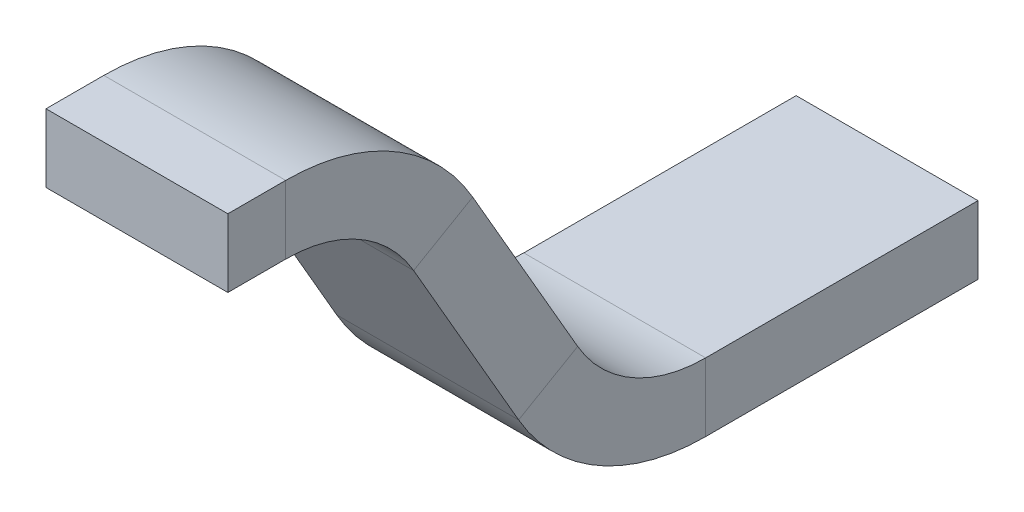
ISO-10303-21;
HEADER;
FILE_DESCRIPTION(('STEP AP214'),'2;1');
FILE_NAME('part.step','',(''),(''),'','','');
FILE_SCHEMA(('AUTOMOTIVE_DESIGN { 1 0 10303 214 1 1 1 1 }'));
ENDSEC;
DATA;
#1=APPLICATION_CONTEXT('core data for automotive mechanical design processes');
#2=APPLICATION_PROTOCOL_DEFINITION('international standard','automotive_design',2000,#1);
#3=PRODUCT_CONTEXT('',#1,'mechanical');
#4=PRODUCT('Part','Part','',(#3));
#5=PRODUCT_RELATED_PRODUCT_CATEGORY('part','',(#4));
#6=PRODUCT_DEFINITION_FORMATION('','',#4);
#7=PRODUCT_DEFINITION_CONTEXT('part definition',#1,'design');
#8=PRODUCT_DEFINITION('design','',#6,#7);
#9=PRODUCT_DEFINITION_SHAPE('','',#8);
#10=(LENGTH_UNIT() NAMED_UNIT(*) SI_UNIT(.MILLI.,.METRE.));
#11=(NAMED_UNIT(*) PLANE_ANGLE_UNIT() SI_UNIT($,.RADIAN.));
#12=(NAMED_UNIT(*) SI_UNIT($,.STERADIAN.) SOLID_ANGLE_UNIT());
#13=UNCERTAINTY_MEASURE_WITH_UNIT(LENGTH_MEASURE(1.E-05),#10,'distance_accuracy_value','');
#14=(GEOMETRIC_REPRESENTATION_CONTEXT(3) GLOBAL_UNCERTAINTY_ASSIGNED_CONTEXT((#13)) GLOBAL_UNIT_ASSIGNED_CONTEXT((#10,
#11,#12)) REPRESENTATION_CONTEXT('',''));
#15=CARTESIAN_POINT('',(0.,0.,0.));
#16=DIRECTION('',(0.,0.,1.));
#17=DIRECTION('',(1.,0.,0.));
#18=AXIS2_PLACEMENT_3D('',#15,#16,#17);
#19=CARTESIAN_POINT('',(0.,0.,0.));
#20=DIRECTION('',(0.,0.,1.));
#21=DIRECTION('',(1.,0.,0.));
#22=AXIS2_PLACEMENT_3D('',#19,#20,#21);
#23=PLANE('',#22);
#24=DIRECTION('',(0.,1.,0.));
#25=VECTOR('',#24,1.);
#26=CARTESIAN_POINT('',(0.2,0.075,0.));
#27=LINE('',#26,#25);
#28=CARTESIAN_POINT('',(0.2,-0.075,0.));
#29=VERTEX_POINT('',#28);
#30=CARTESIAN_POINT('',(0.2,0.075,0.));
#31=VERTEX_POINT('',#30);
#32=EDGE_CURVE('E243',#29,#31,#27,.T.);
#33=ORIENTED_EDGE('',*,*,#32,.T.);
#34=DIRECTION('',(-1.,0.,0.));
#35=VECTOR('',#34,1.);
#36=CARTESIAN_POINT('',(-0.2,0.075,0.));
#37=LINE('',#36,#35);
#38=CARTESIAN_POINT('',(-0.2,0.075,0.));
#39=VERTEX_POINT('',#38);
#40=EDGE_CURVE('E11',#31,#39,#37,.T.);
#41=ORIENTED_EDGE('',*,*,#40,.T.);
#42=DIRECTION('',(0.,-1.,0.));
#43=VECTOR('',#42,1.);
#44=CARTESIAN_POINT('',(-0.2,0.075,0.));
#45=LINE('',#44,#43);
#46=CARTESIAN_POINT('',(-0.2,-0.075,0.));
#47=VERTEX_POINT('',#46);
#48=EDGE_CURVE('E45',#39,#47,#45,.T.);
#49=ORIENTED_EDGE('',*,*,#48,.T.);
#50=DIRECTION('',(1.,0.,0.));
#51=VECTOR('',#50,1.);
#52=CARTESIAN_POINT('',(-0.2,-0.075,0.));
#53=LINE('',#52,#51);
#54=EDGE_CURVE('E93',#47,#29,#53,.T.);
#55=ORIENTED_EDGE('',*,*,#54,.T.);
#56=EDGE_LOOP('',(#33,#41,#49,#55));
#57=FACE_BOUND('',#56,.T.);
#58=ADVANCED_FACE('F17',(#57),#23,.T.);
#59=CARTESIAN_POINT('',(0.,-0.8,-1.65));
#60=DIRECTION('',(0.,0.,1.));
#61=DIRECTION('',(0.,-1.,0.));
#62=AXIS2_PLACEMENT_3D('',#59,#60,#61);
#63=PLANE('',#62);
#64=DIRECTION('',(0.,1.,0.));
#65=VECTOR('',#64,1.);
#66=CARTESIAN_POINT('',(0.2,-0.725,-1.65));
#67=LINE('',#66,#65);
#68=CARTESIAN_POINT('',(0.2,-0.875,-1.65));
#69=VERTEX_POINT('',#68);
#70=CARTESIAN_POINT('',(0.2,-0.725,-1.65));
#71=VERTEX_POINT('',#70);
#72=EDGE_CURVE('E175',#69,#71,#67,.T.);
#73=ORIENTED_EDGE('',*,*,#72,.F.);
#74=DIRECTION('',(1.,0.,0.));
#75=VECTOR('',#74,1.);
#76=CARTESIAN_POINT('',(-0.2,-0.875,-1.65));
#77=LINE('',#76,#75);
#78=CARTESIAN_POINT('',(-0.2,-0.875,-1.65));
#79=VERTEX_POINT('',#78);
#80=EDGE_CURVE('E397',#79,#69,#77,.T.);
#81=ORIENTED_EDGE('',*,*,#80,.F.);
#82=DIRECTION('',(0.,-1.,0.));
#83=VECTOR('',#82,1.);
#84=CARTESIAN_POINT('',(-0.2,-0.725,-1.65));
#85=LINE('',#84,#83);
#86=CARTESIAN_POINT('',(-0.2,-0.725,-1.65));
#87=VERTEX_POINT('',#86);
#88=EDGE_CURVE('E193',#87,#79,#85,.T.);
#89=ORIENTED_EDGE('',*,*,#88,.F.);
#90=DIRECTION('',(-1.,0.,0.));
#91=VECTOR('',#90,1.);
#92=CARTESIAN_POINT('',(-0.2,-0.725,-1.65));
#93=LINE('',#92,#91);
#94=EDGE_CURVE('E206',#71,#87,#93,.T.);
#95=ORIENTED_EDGE('',*,*,#94,.F.);
#96=EDGE_LOOP('',(#73,#81,#89,#95));
#97=FACE_BOUND('',#96,.T.);
#98=ADVANCED_FACE('F494',(#97),#63,.F.);
#99=CARTESIAN_POINT('',(-0.2,0.075,-0.127179676972));
#100=DIRECTION('',(0.,1.,0.));
#101=DIRECTION('',(1.,0.,0.));
#102=AXIS2_PLACEMENT_3D('',#99,#100,#101);
#103=PLANE('',#102);
#104=ORIENTED_EDGE('',*,*,#40,.F.);
#105=DIRECTION('',(0.,0.,1.));
#106=VECTOR('',#105,1.);
#107=CARTESIAN_POINT('',(0.2,0.075,-0.127179676972));
#108=LINE('',#107,#106);
#109=CARTESIAN_POINT('',(0.2,0.075,-0.127179676972));
#110=VERTEX_POINT('',#109);
#111=EDGE_CURVE('E85',#110,#31,#108,.T.);
#112=ORIENTED_EDGE('',*,*,#111,.F.);
#113=DIRECTION('',(-1.,0.,0.));
#114=VECTOR('',#113,1.);
#115=CARTESIAN_POINT('',(-0.2,0.075,-0.127179676972));
#116=LINE('',#115,#114);
#117=CARTESIAN_POINT('',(-0.2,0.075,-0.127179676972));
#118=VERTEX_POINT('',#117);
#119=EDGE_CURVE('E254',#110,#118,#116,.T.);
#120=ORIENTED_EDGE('',*,*,#119,.T.);
#121=DIRECTION('',(0.,0.,1.));
#122=VECTOR('',#121,1.);
#123=CARTESIAN_POINT('',(-0.2,0.075,-0.127179676972));
#124=LINE('',#123,#122);
#125=EDGE_CURVE('E25',#118,#39,#124,.T.);
#126=ORIENTED_EDGE('',*,*,#125,.T.);
#127=EDGE_LOOP('',(#104,#112,#120,#126));
#128=FACE_BOUND('',#127,.T.);
#129=ADVANCED_FACE('F496',(#128),#103,.T.);
#130=CARTESIAN_POINT('',(-0.2,0.075,-0.127179676972));
#131=DIRECTION('',(-1.,0.,0.));
#132=DIRECTION('',(0.,1.,0.));
#133=AXIS2_PLACEMENT_3D('',#130,#131,#132);
#134=PLANE('',#133);
#135=ORIENTED_EDGE('',*,*,#48,.F.);
#136=ORIENTED_EDGE('',*,*,#125,.F.);
#137=DIRECTION('',(0.,-1.,0.));
#138=VECTOR('',#137,1.);
#139=CARTESIAN_POINT('',(-0.2,0.075,-0.127179676972));
#140=LINE('',#139,#138);
#141=CARTESIAN_POINT('',(-0.2,-0.075,-0.127179676972));
#142=VERTEX_POINT('',#141);
#143=EDGE_CURVE('E242',#118,#142,#140,.T.);
#144=ORIENTED_EDGE('',*,*,#143,.T.);
#145=DIRECTION('',(0.,0.,1.));
#146=VECTOR('',#145,1.);
#147=CARTESIAN_POINT('',(-0.2,-0.075,-0.127179676972));
#148=LINE('',#147,#146);
#149=EDGE_CURVE('E268',#142,#47,#148,.T.);
#150=ORIENTED_EDGE('',*,*,#149,.T.);
#151=EDGE_LOOP('',(#135,#136,#144,#150));
#152=FACE_BOUND('',#151,.T.);
#153=ADVANCED_FACE('F479',(#152),#134,.T.);
#154=CARTESIAN_POINT('',(-0.2,-0.075,-0.127179676972));
#155=DIRECTION('',(0.,-1.,0.));
#156=DIRECTION('',(0.,0.,-1.));
#157=AXIS2_PLACEMENT_3D('',#154,#155,#156);
#158=PLANE('',#157);
#159=ORIENTED_EDGE('',*,*,#54,.F.);
#160=ORIENTED_EDGE('',*,*,#149,.F.);
#161=DIRECTION('',(1.,0.,0.));
#162=VECTOR('',#161,1.);
#163=CARTESIAN_POINT('',(-0.2,-0.075,-0.127179676972));
#164=LINE('',#163,#162);
#165=CARTESIAN_POINT('',(0.2,-0.075,-0.127179676972));
#166=VERTEX_POINT('',#165);
#167=EDGE_CURVE('E210',#142,#166,#164,.T.);
#168=ORIENTED_EDGE('',*,*,#167,.T.);
#169=DIRECTION('',(0.,0.,1.));
#170=VECTOR('',#169,1.);
#171=CARTESIAN_POINT('',(0.2,-0.075,-0.127179676972));
#172=LINE('',#171,#170);
#173=EDGE_CURVE('E246',#166,#29,#172,.T.);
#174=ORIENTED_EDGE('',*,*,#173,.T.);
#175=EDGE_LOOP('',(#159,#160,#168,#174));
#176=FACE_BOUND('',#175,.T.);
#177=ADVANCED_FACE('F475',(#176),#158,.T.);
#178=CARTESIAN_POINT('',(0.2,0.075,-0.127179676972));
#179=DIRECTION('',(1.,0.,0.));
#180=DIRECTION('',(0.,1.,0.));
#181=AXIS2_PLACEMENT_3D('',#178,#179,#180);
#182=PLANE('',#181);
#183=ORIENTED_EDGE('',*,*,#32,.F.);
#184=ORIENTED_EDGE('',*,*,#173,.F.);
#185=DIRECTION('',(0.,1.,0.));
#186=VECTOR('',#185,1.);
#187=CARTESIAN_POINT('',(0.2,0.075,-0.127179676972));
#188=LINE('',#187,#186);
#189=EDGE_CURVE('E247',#166,#110,#188,.T.);
#190=ORIENTED_EDGE('',*,*,#189,.T.);
#191=ORIENTED_EDGE('',*,*,#111,.T.);
#192=EDGE_LOOP('',(#183,#184,#190,#191));
#193=FACE_BOUND('',#192,.T.);
#194=ADVANCED_FACE('F507',(#193),#182,.T.);
#195=CARTESIAN_POINT('',(0.2,0.075,-0.127179676972));
#196=DIRECTION('',(-1.,0.,0.));
#197=DIRECTION('',(0.,0.,1.));
#198=AXIS2_PLACEMENT_3D('',#195,#196,#197);
#199=PLANE('',#198);
#200=ORIENTED_EDGE('',*,*,#189,.F.);
#201=CARTESIAN_POINT('',(0.2,-0.4,-0.127179676972));
#202=DIRECTION('',(-1.,0.,0.));
#203=DIRECTION('',(0.,0.,1.));
#204=AXIS2_PLACEMENT_3D('',#201,#202,#203);
#205=CIRCLE('',#204,0.325);
#206=CARTESIAN_POINT('',(0.2,-0.2375,-0.408637933202));
#207=VERTEX_POINT('',#206);
#208=EDGE_CURVE('E239',#166,#207,#205,.T.);
#209=ORIENTED_EDGE('',*,*,#208,.T.);
#210=DIRECTION('',(0.,0.50000000000019,-0.866025403784329));
#211=VECTOR('',#210,1.);
#212=CARTESIAN_POINT('',(0.2,-0.1625,-0.53854174377));
#213=LINE('',#212,#211);
#214=CARTESIAN_POINT('',(0.2,-0.1625,-0.53854174377));
#215=VERTEX_POINT('',#214);
#216=EDGE_CURVE('E143',#207,#215,#213,.T.);
#217=ORIENTED_EDGE('',*,*,#216,.T.);
#218=CARTESIAN_POINT('',(0.2,-0.4,-0.127179676972));
#219=DIRECTION('',(-1.,0.,0.));
#220=DIRECTION('',(0.,0.,1.));
#221=AXIS2_PLACEMENT_3D('',#218,#219,#220);
#222=CIRCLE('',#221,0.475);
#223=EDGE_CURVE('E257',#110,#215,#222,.T.);
#224=ORIENTED_EDGE('',*,*,#223,.F.);
#225=EDGE_LOOP('',(#200,#209,#217,#224));
#226=FACE_BOUND('',#225,.T.);
#227=ADVANCED_FACE('F469',(#226),#199,.F.);
#228=CARTESIAN_POINT('',(0.,-0.4,-0.127179676972));
#229=DIRECTION('',(-1.,0.,0.));
#230=DIRECTION('',(0.,0.,1.));
#231=AXIS2_PLACEMENT_3D('',#228,#229,#230);
#232=CYLINDRICAL_SURFACE('',#231,0.475);
#233=ORIENTED_EDGE('',*,*,#119,.F.);
#234=ORIENTED_EDGE('',*,*,#223,.T.);
#235=DIRECTION('',(-1.,0.,0.));
#236=VECTOR('',#235,1.);
#237=CARTESIAN_POINT('',(-0.2,-0.1625,-0.53854174377));
#238=LINE('',#237,#236);
#239=CARTESIAN_POINT('',(-0.2,-0.1625,-0.53854174377));
#240=VERTEX_POINT('',#239);
#241=EDGE_CURVE('E194',#215,#240,#238,.T.);
#242=ORIENTED_EDGE('',*,*,#241,.T.);
#243=CARTESIAN_POINT('',(-0.2,-0.4,-0.127179676972));
#244=DIRECTION('',(-1.,0.,0.));
#245=DIRECTION('',(0.,0.,1.));
#246=AXIS2_PLACEMENT_3D('',#243,#244,#245);
#247=CIRCLE('',#246,0.475);
#248=EDGE_CURVE('E251',#118,#240,#247,.T.);
#249=ORIENTED_EDGE('',*,*,#248,.F.);
#250=EDGE_LOOP('',(#233,#234,#242,#249));
#251=FACE_BOUND('',#250,.T.);
#252=ADVANCED_FACE('F464',(#251),#232,.T.);
#253=CARTESIAN_POINT('',(-0.2,0.075,-0.127179676972));
#254=DIRECTION('',(1.,0.,0.));
#255=DIRECTION('',(0.,1.,0.));
#256=AXIS2_PLACEMENT_3D('',#253,#254,#255);
#257=PLANE('',#256);
#258=ORIENTED_EDGE('',*,*,#143,.F.);
#259=ORIENTED_EDGE('',*,*,#248,.T.);
#260=DIRECTION('',(0.,-0.50000000000019,0.866025403784329));
#261=VECTOR('',#260,1.);
#262=CARTESIAN_POINT('',(-0.2,-0.1625,-0.53854174377));
#263=LINE('',#262,#261);
#264=CARTESIAN_POINT('',(-0.2,-0.2375,-0.408637933202));
#265=VERTEX_POINT('',#264);
#266=EDGE_CURVE('E146',#240,#265,#263,.T.);
#267=ORIENTED_EDGE('',*,*,#266,.T.);
#268=CARTESIAN_POINT('',(-0.2,-0.4,-0.127179676972));
#269=DIRECTION('',(-1.,0.,0.));
#270=DIRECTION('',(0.,0.,1.));
#271=AXIS2_PLACEMENT_3D('',#268,#269,#270);
#272=CIRCLE('',#271,0.325);
#273=EDGE_CURVE('E236',#142,#265,#272,.T.);
#274=ORIENTED_EDGE('',*,*,#273,.F.);
#275=EDGE_LOOP('',(#258,#259,#267,#274));
#276=FACE_BOUND('',#275,.T.);
#277=ADVANCED_FACE('F481',(#276),#257,.F.);
#278=CARTESIAN_POINT('',(0.,-0.4,-0.127179676972));
#279=DIRECTION('',(-1.,0.,0.));
#280=DIRECTION('',(0.,0.,1.));
#281=AXIS2_PLACEMENT_3D('',#278,#279,#280);
#282=CYLINDRICAL_SURFACE('',#281,0.325);
#283=ORIENTED_EDGE('',*,*,#167,.F.);
#284=ORIENTED_EDGE('',*,*,#273,.T.);
#285=DIRECTION('',(1.,0.,0.));
#286=VECTOR('',#285,1.);
#287=CARTESIAN_POINT('',(-0.2,-0.2375,-0.408637933202));
#288=LINE('',#287,#286);
#289=EDGE_CURVE('E159',#265,#207,#288,.T.);
#290=ORIENTED_EDGE('',*,*,#289,.T.);
#291=ORIENTED_EDGE('',*,*,#208,.F.);
#292=EDGE_LOOP('',(#283,#284,#290,#291));
#293=FACE_BOUND('',#292,.T.);
#294=ADVANCED_FACE('F473',(#293),#282,.F.);
#295=CARTESIAN_POINT('',(0.2,-0.1625,-0.53854174377));
#296=DIRECTION('',(-1.,0.,0.));
#297=DIRECTION('',(0.,0.,1.));
#298=AXIS2_PLACEMENT_3D('',#295,#296,#297);
#299=PLANE('',#298);
#300=ORIENTED_EDGE('',*,*,#216,.F.);
#301=DIRECTION('',(0.,-0.866025403784329,-0.50000000000019));
#302=VECTOR('',#301,1.);
#303=CARTESIAN_POINT('',(0.2,-0.2375,-0.408637933202));
#304=LINE('',#303,#302);
#305=CARTESIAN_POINT('',(0.2,-0.6375,-0.639578040878));
#306=VERTEX_POINT('',#305);
#307=EDGE_CURVE('E136',#207,#306,#304,.T.);
#308=ORIENTED_EDGE('',*,*,#307,.T.);
#309=DIRECTION('',(0.,0.50000000000019,-0.866025403784329));
#310=VECTOR('',#309,1.);
#311=CARTESIAN_POINT('',(0.2,-0.5625,-0.769481851446));
#312=LINE('',#311,#310);
#313=CARTESIAN_POINT('',(0.2,-0.5625,-0.769481851446));
#314=VERTEX_POINT('',#313);
#315=EDGE_CURVE('E140',#306,#314,#312,.T.);
#316=ORIENTED_EDGE('',*,*,#315,.T.);
#317=DIRECTION('',(0.,-0.866025403784329,-0.50000000000019));
#318=VECTOR('',#317,1.);
#319=CARTESIAN_POINT('',(0.2,-0.1625,-0.53854174377));
#320=LINE('',#319,#318);
#321=EDGE_CURVE('E198',#215,#314,#320,.T.);
#322=ORIENTED_EDGE('',*,*,#321,.F.);
#323=EDGE_LOOP('',(#300,#308,#316,#322));
#324=FACE_BOUND('',#323,.T.);
#325=ADVANCED_FACE('F138',(#324),#299,.F.);
#326=CARTESIAN_POINT('',(-0.2,-0.1625,-0.53854174377));
#327=DIRECTION('',(0.,-0.50000000000019,0.866025403784329));
#328=DIRECTION('',(-1.,0.,0.));
#329=AXIS2_PLACEMENT_3D('',#326,#327,#328);
#330=PLANE('',#329);
#331=ORIENTED_EDGE('',*,*,#241,.F.);
#332=ORIENTED_EDGE('',*,*,#321,.T.);
#333=DIRECTION('',(-1.,0.,0.));
#334=VECTOR('',#333,1.);
#335=CARTESIAN_POINT('',(-0.2,-0.5625,-0.769481851446));
#336=LINE('',#335,#334);
#337=CARTESIAN_POINT('',(-0.2,-0.5625,-0.769481851446));
#338=VERTEX_POINT('',#337);
#339=EDGE_CURVE('E217',#314,#338,#336,.T.);
#340=ORIENTED_EDGE('',*,*,#339,.T.);
#341=DIRECTION('',(0.,-0.866025403784329,-0.50000000000019));
#342=VECTOR('',#341,1.);
#343=CARTESIAN_POINT('',(-0.2,-0.1625,-0.53854174377));
#344=LINE('',#343,#342);
#345=EDGE_CURVE('E199',#240,#338,#344,.T.);
#346=ORIENTED_EDGE('',*,*,#345,.F.);
#347=EDGE_LOOP('',(#331,#332,#340,#346));
#348=FACE_BOUND('',#347,.T.);
#349=ADVANCED_FACE('F458',(#348),#330,.F.);
#350=CARTESIAN_POINT('',(-0.2,-0.1625,-0.53854174377));
#351=DIRECTION('',(1.,0.,0.));
#352=DIRECTION('',(0.,0.,-1.));
#353=AXIS2_PLACEMENT_3D('',#350,#351,#352);
#354=PLANE('',#353);
#355=ORIENTED_EDGE('',*,*,#266,.F.);
#356=ORIENTED_EDGE('',*,*,#345,.T.);
#357=DIRECTION('',(0.,-0.50000000000019,0.866025403784329));
#358=VECTOR('',#357,1.);
#359=CARTESIAN_POINT('',(-0.2,-0.5625,-0.769481851446));
#360=LINE('',#359,#358);
#361=CARTESIAN_POINT('',(-0.2,-0.6375,-0.639578040878));
#362=VERTEX_POINT('',#361);
#363=EDGE_CURVE('E170',#338,#362,#360,.T.);
#364=ORIENTED_EDGE('',*,*,#363,.T.);
#365=DIRECTION('',(0.,-0.866025403784329,-0.50000000000019));
#366=VECTOR('',#365,1.);
#367=CARTESIAN_POINT('',(-0.2,-0.2375,-0.408637933202));
#368=LINE('',#367,#366);
#369=EDGE_CURVE('E128',#265,#362,#368,.T.);
#370=ORIENTED_EDGE('',*,*,#369,.F.);
#371=EDGE_LOOP('',(#355,#356,#364,#370));
#372=FACE_BOUND('',#371,.T.);
#373=ADVANCED_FACE('F483',(#372),#354,.F.);
#374=CARTESIAN_POINT('',(-0.2,-0.2375,-0.408637933202));
#375=DIRECTION('',(0.,0.50000000000019,-0.866025403784329));
#376=DIRECTION('',(-1.,0.,0.));
#377=AXIS2_PLACEMENT_3D('',#374,#375,#376);
#378=PLANE('',#377);
#379=ORIENTED_EDGE('',*,*,#289,.F.);
#380=ORIENTED_EDGE('',*,*,#369,.T.);
#381=DIRECTION('',(1.,0.,0.));
#382=VECTOR('',#381,1.);
#383=CARTESIAN_POINT('',(-0.2,-0.6375,-0.639578040878));
#384=LINE('',#383,#382);
#385=EDGE_CURVE('E166',#362,#306,#384,.T.);
#386=ORIENTED_EDGE('',*,*,#385,.T.);
#387=ORIENTED_EDGE('',*,*,#307,.F.);
#388=EDGE_LOOP('',(#379,#380,#386,#387));
#389=FACE_BOUND('',#388,.T.);
#390=ADVANCED_FACE('F173',(#389),#378,.F.);
#391=CARTESIAN_POINT('',(0.2,-0.5625,-0.769481851446));
#392=DIRECTION('',(-1.,0.,0.));
#393=DIRECTION('',(0.,0.,1.));
#394=AXIS2_PLACEMENT_3D('',#391,#392,#393);
#395=PLANE('',#394);
#396=ORIENTED_EDGE('',*,*,#315,.F.);
#397=CARTESIAN_POINT('',(0.2,-0.4,-1.050940107676));
#398=DIRECTION('',(1.,0.,0.));
#399=DIRECTION('',(0.,0.,-1.));
#400=AXIS2_PLACEMENT_3D('',#397,#398,#399);
#401=CIRCLE('',#400,0.475);
#402=CARTESIAN_POINT('',(0.2,-0.875,-1.050940107676));
#403=VERTEX_POINT('',#402);
#404=EDGE_CURVE('E154',#306,#403,#401,.T.);
#405=ORIENTED_EDGE('',*,*,#404,.T.);
#406=DIRECTION('',(0.,1.,0.));
#407=VECTOR('',#406,1.);
#408=CARTESIAN_POINT('',(0.2,-0.725,-1.050940107676));
#409=LINE('',#408,#407);
#410=CARTESIAN_POINT('',(0.2,-0.725,-1.050940107676));
#411=VERTEX_POINT('',#410);
#412=EDGE_CURVE('E183',#403,#411,#409,.T.);
#413=ORIENTED_EDGE('',*,*,#412,.T.);
#414=CARTESIAN_POINT('',(0.2,-0.4,-1.050940107676));
#415=DIRECTION('',(1.,0.,0.));
#416=DIRECTION('',(0.,0.,-1.));
#417=AXIS2_PLACEMENT_3D('',#414,#415,#416);
#418=CIRCLE('',#417,0.325);
#419=EDGE_CURVE('E156',#314,#411,#418,.T.);
#420=ORIENTED_EDGE('',*,*,#419,.F.);
#421=EDGE_LOOP('',(#396,#405,#413,#420));
#422=FACE_BOUND('',#421,.T.);
#423=ADVANCED_FACE('F151',(#422),#395,.F.);
#424=CARTESIAN_POINT('',(0.,-0.4,-1.050940107676));
#425=DIRECTION('',(1.,0.,0.));
#426=DIRECTION('',(0.,0.,-1.));
#427=AXIS2_PLACEMENT_3D('',#424,#425,#426);
#428=CYLINDRICAL_SURFACE('',#427,0.325);
#429=ORIENTED_EDGE('',*,*,#339,.F.);
#430=ORIENTED_EDGE('',*,*,#419,.T.);
#431=DIRECTION('',(-1.,0.,0.));
#432=VECTOR('',#431,1.);
#433=CARTESIAN_POINT('',(-0.2,-0.725,-1.050940107676));
#434=LINE('',#433,#432);
#435=CARTESIAN_POINT('',(-0.2,-0.725,-1.050940107676));
#436=VERTEX_POINT('',#435);
#437=EDGE_CURVE('E188',#411,#436,#434,.T.);
#438=ORIENTED_EDGE('',*,*,#437,.T.);
#439=CARTESIAN_POINT('',(-0.2,-0.4,-1.050940107676));
#440=DIRECTION('',(1.,0.,0.));
#441=DIRECTION('',(0.,0.,-1.));
#442=AXIS2_PLACEMENT_3D('',#439,#440,#441);
#443=CIRCLE('',#442,0.325);
#444=EDGE_CURVE('E213',#338,#436,#443,.T.);
#445=ORIENTED_EDGE('',*,*,#444,.F.);
#446=EDGE_LOOP('',(#429,#430,#438,#445));
#447=FACE_BOUND('',#446,.T.);
#448=ADVANCED_FACE('F440',(#447),#428,.F.);
#449=CARTESIAN_POINT('',(-0.2,-0.5625,-0.769481851446));
#450=DIRECTION('',(1.,0.,0.));
#451=DIRECTION('',(0.,1.,0.));
#452=AXIS2_PLACEMENT_3D('',#449,#450,#451);
#453=PLANE('',#452);
#454=ORIENTED_EDGE('',*,*,#363,.F.);
#455=ORIENTED_EDGE('',*,*,#444,.T.);
#456=DIRECTION('',(0.,-1.,0.));
#457=VECTOR('',#456,1.);
#458=CARTESIAN_POINT('',(-0.2,-0.725,-1.050940107676));
#459=LINE('',#458,#457);
#460=CARTESIAN_POINT('',(-0.2,-0.875,-1.050940107676));
#461=VERTEX_POINT('',#460);
#462=EDGE_CURVE('E385',#436,#461,#459,.T.);
#463=ORIENTED_EDGE('',*,*,#462,.T.);
#464=CARTESIAN_POINT('',(-0.2,-0.4,-1.050940107676));
#465=DIRECTION('',(1.,0.,0.));
#466=DIRECTION('',(0.,0.,-1.));
#467=AXIS2_PLACEMENT_3D('',#464,#465,#466);
#468=CIRCLE('',#467,0.475);
#469=EDGE_CURVE('E171',#362,#461,#468,.T.);
#470=ORIENTED_EDGE('',*,*,#469,.F.);
#471=EDGE_LOOP('',(#454,#455,#463,#470));
#472=FACE_BOUND('',#471,.T.);
#473=ADVANCED_FACE('F485',(#472),#453,.F.);
#474=CARTESIAN_POINT('',(0.,-0.4,-1.050940107676));
#475=DIRECTION('',(1.,0.,0.));
#476=DIRECTION('',(0.,0.,-1.));
#477=AXIS2_PLACEMENT_3D('',#474,#475,#476);
#478=CYLINDRICAL_SURFACE('',#477,0.475);
#479=ORIENTED_EDGE('',*,*,#385,.F.);
#480=ORIENTED_EDGE('',*,*,#469,.T.);
#481=DIRECTION('',(1.,0.,0.));
#482=VECTOR('',#481,1.);
#483=CARTESIAN_POINT('',(-0.2,-0.875,-1.050940107676));
#484=LINE('',#483,#482);
#485=EDGE_CURVE('E168',#461,#403,#484,.T.);
#486=ORIENTED_EDGE('',*,*,#485,.T.);
#487=ORIENTED_EDGE('',*,*,#404,.F.);
#488=EDGE_LOOP('',(#479,#480,#486,#487));
#489=FACE_BOUND('',#488,.T.);
#490=ADVANCED_FACE('F164',(#489),#478,.T.);
#491=CARTESIAN_POINT('',(0.2,-0.725,-1.050940107676));
#492=DIRECTION('',(-1.,0.,0.));
#493=DIRECTION('',(0.,0.,1.));
#494=AXIS2_PLACEMENT_3D('',#491,#492,#493);
#495=PLANE('',#494);
#496=ORIENTED_EDGE('',*,*,#412,.F.);
#497=DIRECTION('',(0.,0.,-1.));
#498=VECTOR('',#497,1.);
#499=CARTESIAN_POINT('',(0.2,-0.875,-1.050940107676));
#500=LINE('',#499,#498);
#501=EDGE_CURVE('E391',#403,#69,#500,.T.);
#502=ORIENTED_EDGE('',*,*,#501,.T.);
#503=ORIENTED_EDGE('',*,*,#72,.T.);
#504=DIRECTION('',(0.,0.,-1.));
#505=VECTOR('',#504,1.);
#506=CARTESIAN_POINT('',(0.2,-0.725,-1.050940107676));
#507=LINE('',#506,#505);
#508=EDGE_CURVE('E192',#411,#71,#507,.T.);
#509=ORIENTED_EDGE('',*,*,#508,.F.);
#510=EDGE_LOOP('',(#496,#502,#503,#509));
#511=FACE_BOUND('',#510,.T.);
#512=ADVANCED_FACE('F432',(#511),#495,.F.);
#513=CARTESIAN_POINT('',(-0.2,-0.725,-1.050940107676));
#514=DIRECTION('',(0.,-1.,0.));
#515=DIRECTION('',(0.,0.,-1.));
#516=AXIS2_PLACEMENT_3D('',#513,#514,#515);
#517=PLANE('',#516);
#518=ORIENTED_EDGE('',*,*,#437,.F.);
#519=ORIENTED_EDGE('',*,*,#508,.T.);
#520=ORIENTED_EDGE('',*,*,#94,.T.);
#521=DIRECTION('',(0.,0.,-1.));
#522=VECTOR('',#521,1.);
#523=CARTESIAN_POINT('',(-0.2,-0.725,-1.050940107676));
#524=LINE('',#523,#522);
#525=EDGE_CURVE('E203',#436,#87,#524,.T.);
#526=ORIENTED_EDGE('',*,*,#525,.F.);
#527=EDGE_LOOP('',(#518,#519,#520,#526));
#528=FACE_BOUND('',#527,.T.);
#529=ADVANCED_FACE('F436',(#528),#517,.F.);
#530=CARTESIAN_POINT('',(-0.2,-0.725,-1.050940107676));
#531=DIRECTION('',(1.,0.,0.));
#532=DIRECTION('',(0.,1.,0.));
#533=AXIS2_PLACEMENT_3D('',#530,#531,#532);
#534=PLANE('',#533);
#535=ORIENTED_EDGE('',*,*,#462,.F.);
#536=ORIENTED_EDGE('',*,*,#525,.T.);
#537=ORIENTED_EDGE('',*,*,#88,.T.);
#538=DIRECTION('',(0.,0.,-1.));
#539=VECTOR('',#538,1.);
#540=CARTESIAN_POINT('',(-0.2,-0.875,-1.050940107676));
#541=LINE('',#540,#539);
#542=EDGE_CURVE('E404',#461,#79,#541,.T.);
#543=ORIENTED_EDGE('',*,*,#542,.F.);
#544=EDGE_LOOP('',(#535,#536,#537,#543));
#545=FACE_BOUND('',#544,.T.);
#546=ADVANCED_FACE('F488',(#545),#534,.F.);
#547=CARTESIAN_POINT('',(-0.2,-0.875,-1.050940107676));
#548=DIRECTION('',(0.,1.,0.));
#549=DIRECTION('',(0.,0.,-1.));
#550=AXIS2_PLACEMENT_3D('',#547,#548,#549);
#551=PLANE('',#550);
#552=ORIENTED_EDGE('',*,*,#485,.F.);
#553=ORIENTED_EDGE('',*,*,#542,.T.);
#554=ORIENTED_EDGE('',*,*,#80,.T.);
#555=ORIENTED_EDGE('',*,*,#501,.F.);
#556=EDGE_LOOP('',(#552,#553,#554,#555));
#557=FACE_BOUND('',#556,.T.);
#558=ADVANCED_FACE('F492',(#557),#551,.F.);
#559=CLOSED_SHELL('',(#58,#98,#129,#153,#177,#194,#227,#252,#277,#294,#325,#349,#373,#390,#423,
#448,#473,#490,#512,#529,#546,#558));
#560=MANIFOLD_SOLID_BREP('B1',#559);
#561=ADVANCED_BREP_SHAPE_REPRESENTATION('',(#18,#560),#14);
#562=SHAPE_DEFINITION_REPRESENTATION(#9,#561);
ENDSEC;
END-ISO-10303-21;
